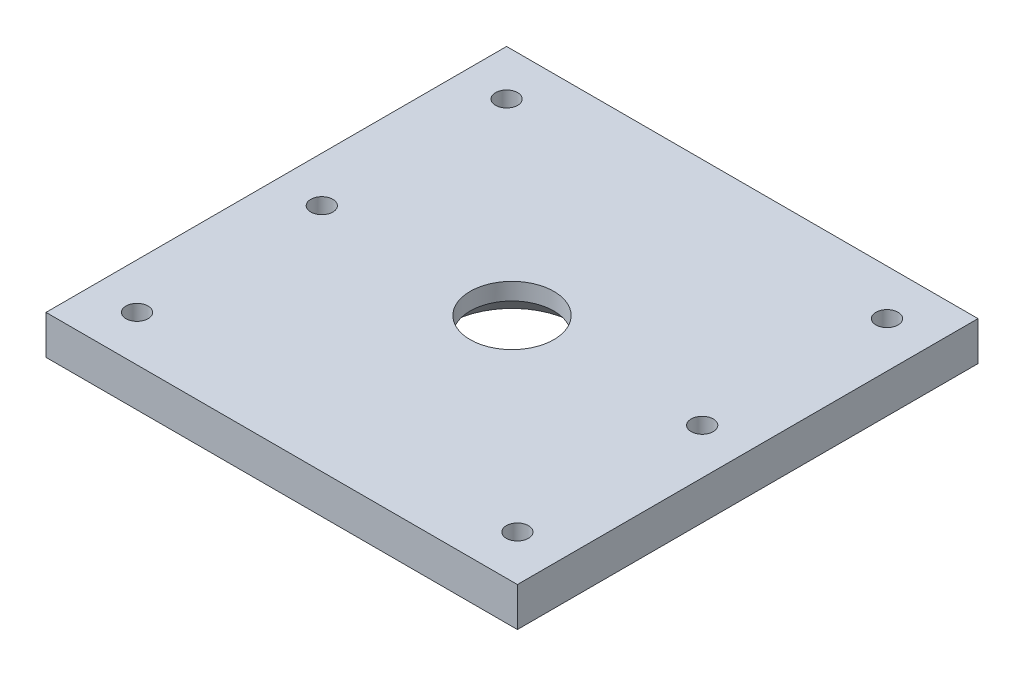
ISO-10303-21;
HEADER;
FILE_DESCRIPTION(('STEP AP214'),'2;1');
FILE_NAME('part.step','',(''),(''),'','','');
FILE_SCHEMA(('AUTOMOTIVE_DESIGN { 1 0 10303 214 1 1 1 1 }'));
ENDSEC;
DATA;
#1=APPLICATION_CONTEXT('core data for automotive mechanical design processes');
#2=APPLICATION_PROTOCOL_DEFINITION('international standard','automotive_design',2000,#1);
#3=PRODUCT_CONTEXT('',#1,'mechanical');
#4=PRODUCT('Part','Part','',(#3));
#5=PRODUCT_RELATED_PRODUCT_CATEGORY('part','',(#4));
#6=PRODUCT_DEFINITION_FORMATION('','',#4);
#7=PRODUCT_DEFINITION_CONTEXT('part definition',#1,'design');
#8=PRODUCT_DEFINITION('design','',#6,#7);
#9=PRODUCT_DEFINITION_SHAPE('','',#8);
#10=(LENGTH_UNIT() NAMED_UNIT(*) SI_UNIT(.MILLI.,.METRE.));
#11=(NAMED_UNIT(*) PLANE_ANGLE_UNIT() SI_UNIT($,.RADIAN.));
#12=(NAMED_UNIT(*) SI_UNIT($,.STERADIAN.) SOLID_ANGLE_UNIT());
#13=UNCERTAINTY_MEASURE_WITH_UNIT(LENGTH_MEASURE(1.E-05),#10,'distance_accuracy_value','');
#14=(GEOMETRIC_REPRESENTATION_CONTEXT(3) GLOBAL_UNCERTAINTY_ASSIGNED_CONTEXT((#13)) GLOBAL_UNIT_ASSIGNED_CONTEXT((#10,
#11,#12)) REPRESENTATION_CONTEXT('',''));
#15=CARTESIAN_POINT('',(0.,0.,0.));
#16=DIRECTION('',(0.,0.,1.));
#17=DIRECTION('',(1.,0.,0.));
#18=AXIS2_PLACEMENT_3D('',#15,#16,#17);
#19=CARTESIAN_POINT('',(-38.38,6.35,37.5));
#20=DIRECTION('',(-1.,0.,0.));
#21=DIRECTION('',(0.,0.,1.));
#22=AXIS2_PLACEMENT_3D('',#19,#20,#21);
#23=PLANE('',#22);
#24=DIRECTION('',(0.,0.,-1.));
#25=VECTOR('',#24,1.);
#26=CARTESIAN_POINT('',(-38.38,0.,37.5));
#27=LINE('',#26,#25);
#28=CARTESIAN_POINT('',(-38.38,0.,37.5));
#29=VERTEX_POINT('',#28);
#30=CARTESIAN_POINT('',(-38.38,0.,-37.5));
#31=VERTEX_POINT('',#30);
#32=EDGE_CURVE('E124',#29,#31,#27,.T.);
#33=ORIENTED_EDGE('',*,*,#32,.F.);
#34=DIRECTION('',(0.,-1.,0.));
#35=VECTOR('',#34,1.);
#36=CARTESIAN_POINT('',(-38.38,6.35,37.5));
#37=LINE('',#36,#35);
#38=CARTESIAN_POINT('',(-38.38,6.35,37.5));
#39=VERTEX_POINT('',#38);
#40=EDGE_CURVE('E66',#39,#29,#37,.T.);
#41=ORIENTED_EDGE('',*,*,#40,.F.);
#42=DIRECTION('',(0.,0.,-1.));
#43=VECTOR('',#42,1.);
#44=CARTESIAN_POINT('',(-38.38,6.35,37.5));
#45=LINE('',#44,#43);
#46=CARTESIAN_POINT('',(-38.38,6.35,-37.5));
#47=VERTEX_POINT('',#46);
#48=EDGE_CURVE('E116',#39,#47,#45,.T.);
#49=ORIENTED_EDGE('',*,*,#48,.T.);
#50=DIRECTION('',(0.,-1.,0.));
#51=VECTOR('',#50,1.);
#52=CARTESIAN_POINT('',(-38.38,6.35,-37.5));
#53=LINE('',#52,#51);
#54=EDGE_CURVE('E91',#47,#31,#53,.T.);
#55=ORIENTED_EDGE('',*,*,#54,.T.);
#56=EDGE_LOOP('',(#33,#41,#49,#55));
#57=FACE_BOUND('',#56,.T.);
#58=ADVANCED_FACE('F47',(#57),#23,.T.);
#59=CARTESIAN_POINT('',(-38.38,6.35,37.5));
#60=DIRECTION('',(0.,0.,-1.));
#61=DIRECTION('',(-1.,0.,0.));
#62=AXIS2_PLACEMENT_3D('',#59,#60,#61);
#63=PLANE('',#62);
#64=DIRECTION('',(1.,0.,0.));
#65=VECTOR('',#64,1.);
#66=CARTESIAN_POINT('',(-38.38,0.,37.5));
#67=LINE('',#66,#65);
#68=CARTESIAN_POINT('',(38.38,0.,37.5));
#69=VERTEX_POINT('',#68);
#70=EDGE_CURVE('E83',#29,#69,#67,.T.);
#71=ORIENTED_EDGE('',*,*,#70,.T.);
#72=DIRECTION('',(0.,-1.,0.));
#73=VECTOR('',#72,1.);
#74=CARTESIAN_POINT('',(38.38,6.35,37.5));
#75=LINE('',#74,#73);
#76=CARTESIAN_POINT('',(38.38,6.35,37.5));
#77=VERTEX_POINT('',#76);
#78=EDGE_CURVE('E112',#77,#69,#75,.T.);
#79=ORIENTED_EDGE('',*,*,#78,.F.);
#80=DIRECTION('',(1.,0.,0.));
#81=VECTOR('',#80,1.);
#82=CARTESIAN_POINT('',(-38.38,6.35,37.5));
#83=LINE('',#82,#81);
#84=EDGE_CURVE('E101',#39,#77,#83,.T.);
#85=ORIENTED_EDGE('',*,*,#84,.F.);
#86=ORIENTED_EDGE('',*,*,#40,.T.);
#87=EDGE_LOOP('',(#71,#79,#85,#86));
#88=FACE_BOUND('',#87,.T.);
#89=ADVANCED_FACE('F160',(#88),#63,.F.);
#90=CARTESIAN_POINT('',(38.38,6.35,37.5));
#91=DIRECTION('',(-1.,0.,0.));
#92=DIRECTION('',(0.,0.,1.));
#93=AXIS2_PLACEMENT_3D('',#90,#91,#92);
#94=PLANE('',#93);
#95=DIRECTION('',(0.,0.,-1.));
#96=VECTOR('',#95,1.);
#97=CARTESIAN_POINT('',(38.38,0.,37.5));
#98=LINE('',#97,#96);
#99=CARTESIAN_POINT('',(38.38,0.,-37.5));
#100=VERTEX_POINT('',#99);
#101=EDGE_CURVE('E109',#69,#100,#98,.T.);
#102=ORIENTED_EDGE('',*,*,#101,.T.);
#103=DIRECTION('',(0.,-1.,0.));
#104=VECTOR('',#103,1.);
#105=CARTESIAN_POINT('',(38.38,6.35,-37.5));
#106=LINE('',#105,#104);
#107=CARTESIAN_POINT('',(38.38,6.35,-37.5));
#108=VERTEX_POINT('',#107);
#109=EDGE_CURVE('E106',#108,#100,#106,.T.);
#110=ORIENTED_EDGE('',*,*,#109,.F.);
#111=DIRECTION('',(0.,0.,-1.));
#112=VECTOR('',#111,1.);
#113=CARTESIAN_POINT('',(38.38,6.35,37.5));
#114=LINE('',#113,#112);
#115=EDGE_CURVE('E96',#77,#108,#114,.T.);
#116=ORIENTED_EDGE('',*,*,#115,.F.);
#117=ORIENTED_EDGE('',*,*,#78,.T.);
#118=EDGE_LOOP('',(#102,#110,#116,#117));
#119=FACE_BOUND('',#118,.T.);
#120=ADVANCED_FACE('F107',(#119),#94,.F.);
#121=CARTESIAN_POINT('',(-38.38,6.35,-37.5));
#122=DIRECTION('',(0.,0.,-1.));
#123=DIRECTION('',(-1.,0.,0.));
#124=AXIS2_PLACEMENT_3D('',#121,#122,#123);
#125=PLANE('',#124);
#126=DIRECTION('',(1.,0.,0.));
#127=VECTOR('',#126,1.);
#128=CARTESIAN_POINT('',(-38.38,0.,-37.5));
#129=LINE('',#128,#127);
#130=EDGE_CURVE('E128',#31,#100,#129,.T.);
#131=ORIENTED_EDGE('',*,*,#130,.F.);
#132=ORIENTED_EDGE('',*,*,#54,.F.);
#133=DIRECTION('',(1.,0.,0.));
#134=VECTOR('',#133,1.);
#135=CARTESIAN_POINT('',(-38.38,6.35,-37.5));
#136=LINE('',#135,#134);
#137=EDGE_CURVE('E100',#47,#108,#136,.T.);
#138=ORIENTED_EDGE('',*,*,#137,.T.);
#139=ORIENTED_EDGE('',*,*,#109,.T.);
#140=EDGE_LOOP('',(#131,#132,#138,#139));
#141=FACE_BOUND('',#140,.T.);
#142=ADVANCED_FACE('F114',(#141),#125,.T.);
#143=CARTESIAN_POINT('',(0.,6.35,0.));
#144=DIRECTION('',(0.,-1.,0.));
#145=DIRECTION('',(0.,0.,-1.));
#146=AXIS2_PLACEMENT_3D('',#143,#144,#145);
#147=PLANE('',#146);
#148=CARTESIAN_POINT('',(-30.97,6.35,30.09));
#149=DIRECTION('',(0.,1.,0.));
#150=DIRECTION('',(0.,0.,1.));
#151=AXIS2_PLACEMENT_3D('',#148,#149,#150);
#152=CIRCLE('',#151,1.8);
#153=CARTESIAN_POINT('',(-30.97,6.35,31.89));
#154=VERTEX_POINT('',#153);
#155=EDGE_CURVE('E216',#154,#154,#152,.T.);
#156=ORIENTED_EDGE('',*,*,#155,.F.);
#157=EDGE_LOOP('',(#156));
#158=FACE_BOUND('',#157,.T.);
#159=CARTESIAN_POINT('',(30.97,6.35,30.09));
#160=DIRECTION('',(0.,1.,0.));
#161=DIRECTION('',(0.,0.,1.));
#162=AXIS2_PLACEMENT_3D('',#159,#160,#161);
#163=CIRCLE('',#162,1.8);
#164=CARTESIAN_POINT('',(30.97,6.35,31.89));
#165=VERTEX_POINT('',#164);
#166=EDGE_CURVE('E225',#165,#165,#163,.T.);
#167=ORIENTED_EDGE('',*,*,#166,.F.);
#168=EDGE_LOOP('',(#167));
#169=FACE_BOUND('',#168,.T.);
#170=CARTESIAN_POINT('',(30.97,6.35,-30.09));
#171=DIRECTION('',(0.,1.,0.));
#172=DIRECTION('',(0.,0.,1.));
#173=AXIS2_PLACEMENT_3D('',#170,#171,#172);
#174=CIRCLE('',#173,1.8);
#175=CARTESIAN_POINT('',(30.97,6.35,-28.29));
#176=VERTEX_POINT('',#175);
#177=EDGE_CURVE('E233',#176,#176,#174,.T.);
#178=ORIENTED_EDGE('',*,*,#177,.F.);
#179=EDGE_LOOP('',(#178));
#180=FACE_BOUND('',#179,.T.);
#181=CARTESIAN_POINT('',(-30.97,6.35,0.));
#182=DIRECTION('',(0.,1.,0.));
#183=DIRECTION('',(0.,0.,1.));
#184=AXIS2_PLACEMENT_3D('',#181,#182,#183);
#185=CIRCLE('',#184,1.8);
#186=CARTESIAN_POINT('',(-30.97,6.35,1.8));
#187=VERTEX_POINT('',#186);
#188=EDGE_CURVE('E212',#187,#187,#185,.T.);
#189=ORIENTED_EDGE('',*,*,#188,.F.);
#190=EDGE_LOOP('',(#189));
#191=FACE_BOUND('',#190,.T.);
#192=CARTESIAN_POINT('',(30.97,6.35,0.));
#193=DIRECTION('',(0.,1.,0.));
#194=DIRECTION('',(0.,0.,1.));
#195=AXIS2_PLACEMENT_3D('',#192,#193,#194);
#196=CIRCLE('',#195,1.8);
#197=CARTESIAN_POINT('',(30.97,6.35,1.8));
#198=VERTEX_POINT('',#197);
#199=EDGE_CURVE('E204',#198,#198,#196,.T.);
#200=ORIENTED_EDGE('',*,*,#199,.F.);
#201=EDGE_LOOP('',(#200));
#202=FACE_BOUND('',#201,.T.);
#203=CARTESIAN_POINT('',(-30.97,6.35,-30.09));
#204=DIRECTION('',(0.,1.,0.));
#205=DIRECTION('',(0.,0.,1.));
#206=AXIS2_PLACEMENT_3D('',#203,#204,#205);
#207=CIRCLE('',#206,1.8);
#208=CARTESIAN_POINT('',(-30.97,6.35,-28.29));
#209=VERTEX_POINT('',#208);
#210=EDGE_CURVE('E220',#209,#209,#207,.T.);
#211=ORIENTED_EDGE('',*,*,#210,.F.);
#212=EDGE_LOOP('',(#211));
#213=FACE_BOUND('',#212,.T.);
#214=CARTESIAN_POINT('',(0.,6.35,0.));
#215=DIRECTION('',(0.,1.,0.));
#216=DIRECTION('',(0.,0.,1.));
#217=AXIS2_PLACEMENT_3D('',#214,#215,#216);
#218=CIRCLE('',#217,6.815);
#219=CARTESIAN_POINT('',(0.,6.35,6.815));
#220=VERTEX_POINT('',#219);
#221=EDGE_CURVE('E129',#220,#220,#218,.T.);
#222=ORIENTED_EDGE('',*,*,#221,.F.);
#223=EDGE_LOOP('',(#222));
#224=FACE_BOUND('',#223,.T.);
#225=ORIENTED_EDGE('',*,*,#48,.F.);
#226=ORIENTED_EDGE('',*,*,#84,.T.);
#227=ORIENTED_EDGE('',*,*,#115,.T.);
#228=ORIENTED_EDGE('',*,*,#137,.F.);
#229=EDGE_LOOP('',(#225,#226,#227,#228));
#230=FACE_BOUND('',#229,.T.);
#231=ADVANCED_FACE('F99',(#158,#169,#180,#191,#202,#213,#224,#230),#147,.F.);
#232=CARTESIAN_POINT('',(0.,0.,0.));
#233=DIRECTION('',(0.,-1.,0.));
#234=DIRECTION('',(0.,0.,-1.));
#235=AXIS2_PLACEMENT_3D('',#232,#233,#234);
#236=PLANE('',#235);
#237=CARTESIAN_POINT('',(0.,0.,0.));
#238=DIRECTION('',(0.,-1.,0.));
#239=DIRECTION('',(0.,0.,-1.));
#240=AXIS2_PLACEMENT_3D('',#237,#238,#239);
#241=CIRCLE('',#240,10.395);
#242=CARTESIAN_POINT('',(0.,0.,-10.395));
#243=VERTEX_POINT('',#242);
#244=EDGE_CURVE('E58',#243,#243,#241,.F.);
#245=ORIENTED_EDGE('',*,*,#244,.T.);
#246=EDGE_LOOP('',(#245));
#247=FACE_BOUND('',#246,.T.);
#248=CARTESIAN_POINT('',(-30.97,0.,30.09));
#249=DIRECTION('',(0.,1.,0.));
#250=DIRECTION('',(0.,0.,1.));
#251=AXIS2_PLACEMENT_3D('',#248,#249,#250);
#252=CIRCLE('',#251,1.8);
#253=CARTESIAN_POINT('',(-30.97,0.,31.89));
#254=VERTEX_POINT('',#253);
#255=EDGE_CURVE('E221',#254,#254,#252,.T.);
#256=ORIENTED_EDGE('',*,*,#255,.T.);
#257=EDGE_LOOP('',(#256));
#258=FACE_BOUND('',#257,.T.);
#259=CARTESIAN_POINT('',(30.97,0.,30.09));
#260=DIRECTION('',(0.,1.,0.));
#261=DIRECTION('',(0.,0.,1.));
#262=AXIS2_PLACEMENT_3D('',#259,#260,#261);
#263=CIRCLE('',#262,1.8);
#264=CARTESIAN_POINT('',(30.97,0.,31.89));
#265=VERTEX_POINT('',#264);
#266=EDGE_CURVE('E229',#265,#265,#263,.T.);
#267=ORIENTED_EDGE('',*,*,#266,.T.);
#268=EDGE_LOOP('',(#267));
#269=FACE_BOUND('',#268,.T.);
#270=CARTESIAN_POINT('',(30.97,0.,-30.09));
#271=DIRECTION('',(0.,1.,0.));
#272=DIRECTION('',(0.,0.,1.));
#273=AXIS2_PLACEMENT_3D('',#270,#271,#272);
#274=CIRCLE('',#273,1.8);
#275=CARTESIAN_POINT('',(30.97,0.,-28.29));
#276=VERTEX_POINT('',#275);
#277=EDGE_CURVE('E237',#276,#276,#274,.T.);
#278=ORIENTED_EDGE('',*,*,#277,.T.);
#279=EDGE_LOOP('',(#278));
#280=FACE_BOUND('',#279,.T.);
#281=CARTESIAN_POINT('',(-30.97,0.,0.));
#282=DIRECTION('',(0.,1.,0.));
#283=DIRECTION('',(0.,0.,1.));
#284=AXIS2_PLACEMENT_3D('',#281,#282,#283);
#285=CIRCLE('',#284,1.8);
#286=CARTESIAN_POINT('',(-30.97,0.,1.8));
#287=VERTEX_POINT('',#286);
#288=EDGE_CURVE('E207',#287,#287,#285,.T.);
#289=ORIENTED_EDGE('',*,*,#288,.T.);
#290=EDGE_LOOP('',(#289));
#291=FACE_BOUND('',#290,.T.);
#292=CARTESIAN_POINT('',(30.97,0.,0.));
#293=DIRECTION('',(0.,1.,0.));
#294=DIRECTION('',(0.,0.,1.));
#295=AXIS2_PLACEMENT_3D('',#292,#293,#294);
#296=CIRCLE('',#295,1.8);
#297=CARTESIAN_POINT('',(30.97,0.,1.8));
#298=VERTEX_POINT('',#297);
#299=EDGE_CURVE('E201',#298,#298,#296,.T.);
#300=ORIENTED_EDGE('',*,*,#299,.T.);
#301=EDGE_LOOP('',(#300));
#302=FACE_BOUND('',#301,.T.);
#303=CARTESIAN_POINT('',(-30.97,0.,-30.09));
#304=DIRECTION('',(0.,1.,0.));
#305=DIRECTION('',(0.,0.,1.));
#306=AXIS2_PLACEMENT_3D('',#303,#304,#305);
#307=CIRCLE('',#306,1.8);
#308=CARTESIAN_POINT('',(-30.97,0.,-28.29));
#309=VERTEX_POINT('',#308);
#310=EDGE_CURVE('E244',#309,#309,#307,.T.);
#311=ORIENTED_EDGE('',*,*,#310,.T.);
#312=EDGE_LOOP('',(#311));
#313=FACE_BOUND('',#312,.T.);
#314=ORIENTED_EDGE('',*,*,#32,.T.);
#315=ORIENTED_EDGE('',*,*,#130,.T.);
#316=ORIENTED_EDGE('',*,*,#101,.F.);
#317=ORIENTED_EDGE('',*,*,#70,.F.);
#318=EDGE_LOOP('',(#314,#315,#316,#317));
#319=FACE_BOUND('',#318,.T.);
#320=ADVANCED_FACE('F145',(#247,#258,#269,#280,#291,#302,#313,#319),#236,.T.);
#321=CARTESIAN_POINT('',(0.,0.,0.));
#322=DIRECTION('',(0.,1.,0.));
#323=DIRECTION('',(0.,0.,1.));
#324=AXIS2_PLACEMENT_3D('',#321,#322,#323);
#325=CYLINDRICAL_SURFACE('',#324,6.815);
#326=CARTESIAN_POINT('',(0.,3.58000000000002,0.));
#327=DIRECTION('',(0.,-1.,0.));
#328=DIRECTION('',(0.,0.,-1.));
#329=AXIS2_PLACEMENT_3D('',#326,#327,#328);
#330=CIRCLE('',#329,6.815);
#331=CARTESIAN_POINT('',(0.,3.58000000000002,-6.815));
#332=VERTEX_POINT('',#331);
#333=EDGE_CURVE('E11',#332,#332,#330,.T.);
#334=ORIENTED_EDGE('',*,*,#333,.T.);
#335=EDGE_LOOP('',(#334));
#336=FACE_BOUND('',#335,.T.);
#337=ORIENTED_EDGE('',*,*,#221,.T.);
#338=EDGE_LOOP('',(#337));
#339=FACE_BOUND('',#338,.T.);
#340=ADVANCED_FACE('F172',(#336,#339),#325,.F.);
#341=CARTESIAN_POINT('',(-30.97,0.,-30.09));
#342=DIRECTION('',(0.,1.,0.));
#343=DIRECTION('',(0.,0.,1.));
#344=AXIS2_PLACEMENT_3D('',#341,#342,#343);
#345=CYLINDRICAL_SURFACE('',#344,1.8);
#346=ORIENTED_EDGE('',*,*,#310,.F.);
#347=EDGE_LOOP('',(#346));
#348=FACE_BOUND('',#347,.T.);
#349=ORIENTED_EDGE('',*,*,#210,.T.);
#350=EDGE_LOOP('',(#349));
#351=FACE_BOUND('',#350,.T.);
#352=ADVANCED_FACE('F177',(#348,#351),#345,.F.);
#353=CARTESIAN_POINT('',(30.97,0.,0.));
#354=DIRECTION('',(0.,1.,0.));
#355=DIRECTION('',(0.,0.,1.));
#356=AXIS2_PLACEMENT_3D('',#353,#354,#355);
#357=CYLINDRICAL_SURFACE('',#356,1.8);
#358=ORIENTED_EDGE('',*,*,#299,.F.);
#359=EDGE_LOOP('',(#358));
#360=FACE_BOUND('',#359,.T.);
#361=ORIENTED_EDGE('',*,*,#199,.T.);
#362=EDGE_LOOP('',(#361));
#363=FACE_BOUND('',#362,.T.);
#364=ADVANCED_FACE('F181',(#360,#363),#357,.F.);
#365=CARTESIAN_POINT('',(-30.97,0.,0.));
#366=DIRECTION('',(0.,1.,0.));
#367=DIRECTION('',(0.,0.,1.));
#368=AXIS2_PLACEMENT_3D('',#365,#366,#367);
#369=CYLINDRICAL_SURFACE('',#368,1.8);
#370=ORIENTED_EDGE('',*,*,#288,.F.);
#371=EDGE_LOOP('',(#370));
#372=FACE_BOUND('',#371,.T.);
#373=ORIENTED_EDGE('',*,*,#188,.T.);
#374=EDGE_LOOP('',(#373));
#375=FACE_BOUND('',#374,.T.);
#376=ADVANCED_FACE('F183',(#372,#375),#369,.F.);
#377=CARTESIAN_POINT('',(30.97,0.,-30.09));
#378=DIRECTION('',(0.,1.,0.));
#379=DIRECTION('',(0.,0.,1.));
#380=AXIS2_PLACEMENT_3D('',#377,#378,#379);
#381=CYLINDRICAL_SURFACE('',#380,1.8);
#382=ORIENTED_EDGE('',*,*,#277,.F.);
#383=EDGE_LOOP('',(#382));
#384=FACE_BOUND('',#383,.T.);
#385=ORIENTED_EDGE('',*,*,#177,.T.);
#386=EDGE_LOOP('',(#385));
#387=FACE_BOUND('',#386,.T.);
#388=ADVANCED_FACE('F186',(#384,#387),#381,.F.);
#389=CARTESIAN_POINT('',(30.97,0.,30.09));
#390=DIRECTION('',(0.,1.,0.));
#391=DIRECTION('',(0.,0.,1.));
#392=AXIS2_PLACEMENT_3D('',#389,#390,#391);
#393=CYLINDRICAL_SURFACE('',#392,1.8);
#394=ORIENTED_EDGE('',*,*,#266,.F.);
#395=EDGE_LOOP('',(#394));
#396=FACE_BOUND('',#395,.T.);
#397=ORIENTED_EDGE('',*,*,#166,.T.);
#398=EDGE_LOOP('',(#397));
#399=FACE_BOUND('',#398,.T.);
#400=ADVANCED_FACE('F155',(#396,#399),#393,.F.);
#401=CARTESIAN_POINT('',(-30.97,0.,30.09));
#402=DIRECTION('',(0.,1.,0.));
#403=DIRECTION('',(0.,0.,1.));
#404=AXIS2_PLACEMENT_3D('',#401,#402,#403);
#405=CYLINDRICAL_SURFACE('',#404,1.8);
#406=ORIENTED_EDGE('',*,*,#255,.F.);
#407=EDGE_LOOP('',(#406));
#408=FACE_BOUND('',#407,.T.);
#409=ORIENTED_EDGE('',*,*,#155,.T.);
#410=EDGE_LOOP('',(#409));
#411=FACE_BOUND('',#410,.T.);
#412=ADVANCED_FACE('F149',(#408,#411),#405,.F.);
#413=CARTESIAN_POINT('',(0.,0.,0.));
#414=DIRECTION('',(0.,-1.,0.));
#415=DIRECTION('',(0.,0.,-1.));
#416=AXIS2_PLACEMENT_3D('',#413,#414,#415);
#417=CONICAL_SURFACE('',#416,10.395,0.785398163397446);
#418=ORIENTED_EDGE('',*,*,#333,.F.);
#419=EDGE_LOOP('',(#418));
#420=FACE_BOUND('',#419,.T.);
#421=ORIENTED_EDGE('',*,*,#244,.F.);
#422=EDGE_LOOP('',(#421));
#423=FACE_BOUND('',#422,.T.);
#424=ADVANCED_FACE('F50',(#420,#423),#417,.F.);
#425=CLOSED_SHELL('',(#58,#89,#120,#142,#231,#320,#340,#352,#364,#376,#388,#400,#412,#424));
#426=MANIFOLD_SOLID_BREP('B2',#425);
#427=ADVANCED_BREP_SHAPE_REPRESENTATION('',(#18,#426),#14);
#428=SHAPE_DEFINITION_REPRESENTATION(#9,#427);
ENDSEC;
END-ISO-10303-21;
